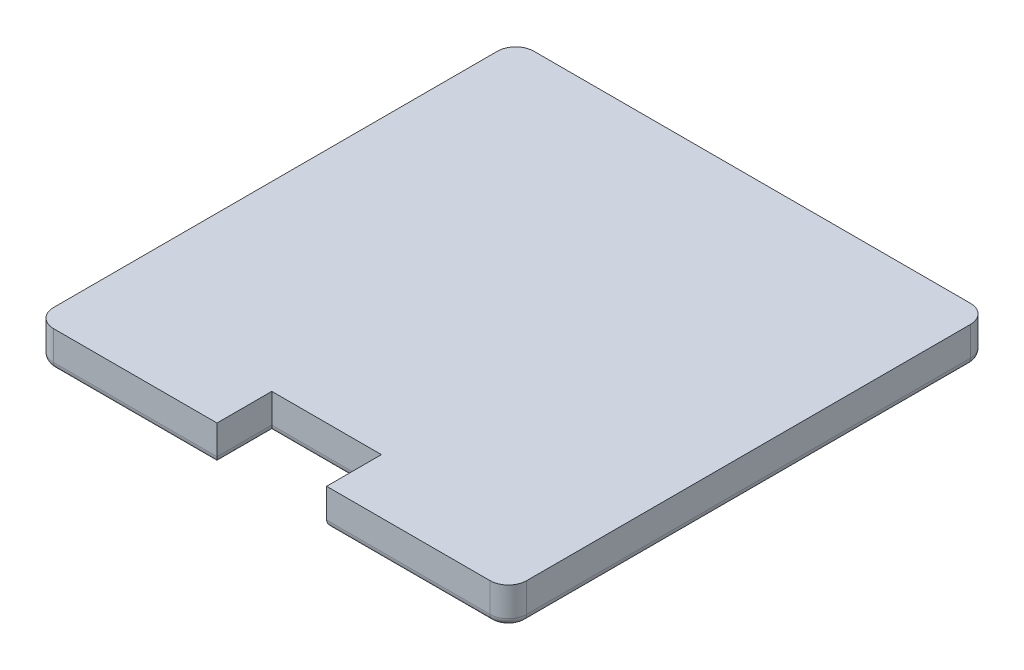
ISO-10303-21;
HEADER;
FILE_DESCRIPTION(('STEP AP214'),'2;1');
FILE_NAME('part.step','',(''),(''),'','','');
FILE_SCHEMA(('AUTOMOTIVE_DESIGN { 1 0 10303 214 1 1 1 1 }'));
ENDSEC;
DATA;
#1=APPLICATION_CONTEXT('core data for automotive mechanical design processes');
#2=APPLICATION_PROTOCOL_DEFINITION('international standard','automotive_design',2000,#1);
#3=PRODUCT_CONTEXT('',#1,'mechanical');
#4=PRODUCT('Part','Part','',(#3));
#5=PRODUCT_RELATED_PRODUCT_CATEGORY('part','',(#4));
#6=PRODUCT_DEFINITION_FORMATION('','',#4);
#7=PRODUCT_DEFINITION_CONTEXT('part definition',#1,'design');
#8=PRODUCT_DEFINITION('design','',#6,#7);
#9=PRODUCT_DEFINITION_SHAPE('','',#8);
#10=(LENGTH_UNIT() NAMED_UNIT(*) SI_UNIT(.MILLI.,.METRE.));
#11=(NAMED_UNIT(*) PLANE_ANGLE_UNIT() SI_UNIT($,.RADIAN.));
#12=(NAMED_UNIT(*) SI_UNIT($,.STERADIAN.) SOLID_ANGLE_UNIT());
#13=UNCERTAINTY_MEASURE_WITH_UNIT(LENGTH_MEASURE(1.E-05),#10,'distance_accuracy_value','');
#14=(GEOMETRIC_REPRESENTATION_CONTEXT(3) GLOBAL_UNCERTAINTY_ASSIGNED_CONTEXT((#13)) GLOBAL_UNIT_ASSIGNED_CONTEXT((#10,
#11,#12)) REPRESENTATION_CONTEXT('',''));
#15=CARTESIAN_POINT('',(0.,0.,0.));
#16=DIRECTION('',(0.,0.,1.));
#17=DIRECTION('',(1.,0.,0.));
#18=AXIS2_PLACEMENT_3D('',#15,#16,#17);
#19=CARTESIAN_POINT('',(-15.1765,2.54,15.4305));
#20=DIRECTION('',(0.,-1.,0.));
#21=DIRECTION('',(0.,0.,-1.));
#22=AXIS2_PLACEMENT_3D('',#19,#20,#21);
#23=CYLINDRICAL_SURFACE('',#22,1.27);
#24=DIRECTION('',(0.,-1.,0.));
#25=VECTOR('',#24,1.);
#26=CARTESIAN_POINT('',(-16.4465,2.54,15.4305));
#27=LINE('',#26,#25);
#28=CARTESIAN_POINT('',(-16.4465,2.54,15.4305));
#29=VERTEX_POINT('',#28);
#30=CARTESIAN_POINT('',(-16.4465,0.508,15.4305));
#31=VERTEX_POINT('',#30);
#32=EDGE_CURVE('E386',#29,#31,#27,.T.);
#33=ORIENTED_EDGE('',*,*,#32,.T.);
#34=CARTESIAN_POINT('',(-15.1765,0.508,15.4305));
#35=DIRECTION('',(0.,-1.,0.));
#36=DIRECTION('',(0.,0.,-1.));
#37=AXIS2_PLACEMENT_3D('',#34,#35,#36);
#38=CIRCLE('',#37,1.27);
#39=CARTESIAN_POINT('',(-15.1765,0.508,16.7005));
#40=VERTEX_POINT('',#39);
#41=EDGE_CURVE('E11',#31,#40,#38,.F.);
#42=ORIENTED_EDGE('',*,*,#41,.T.);
#43=DIRECTION('',(0.,-1.,0.));
#44=VECTOR('',#43,1.);
#45=CARTESIAN_POINT('',(-15.1765,2.54,16.7005));
#46=LINE('',#45,#44);
#47=CARTESIAN_POINT('',(-15.1765,2.54,16.7005));
#48=VERTEX_POINT('',#47);
#49=EDGE_CURVE('E179',#48,#40,#46,.T.);
#50=ORIENTED_EDGE('',*,*,#49,.F.);
#51=CARTESIAN_POINT('',(-15.1765,2.54,15.4305));
#52=DIRECTION('',(0.,1.,0.));
#53=DIRECTION('',(0.,0.,-1.));
#54=AXIS2_PLACEMENT_3D('',#51,#52,#53);
#55=CIRCLE('',#54,1.27);
#56=EDGE_CURVE('E187',#29,#48,#55,.T.);
#57=ORIENTED_EDGE('',*,*,#56,.F.);
#58=EDGE_LOOP('',(#33,#42,#50,#57));
#59=FACE_BOUND('',#58,.T.);
#60=ADVANCED_FACE('F45',(#59),#23,.T.);
#61=CARTESIAN_POINT('',(-15.1765,2.54,16.7005));
#62=DIRECTION('',(0.,0.,-1.));
#63=DIRECTION('',(-1.,0.,0.));
#64=AXIS2_PLACEMENT_3D('',#61,#62,#63);
#65=PLANE('',#64);
#66=ORIENTED_EDGE('',*,*,#49,.T.);
#67=DIRECTION('',(1.,0.,0.));
#68=VECTOR('',#67,1.);
#69=CARTESIAN_POINT('',(-3.81,0.508,16.7005));
#70=LINE('',#69,#68);
#71=CARTESIAN_POINT('',(-3.81,0.508,16.7005));
#72=VERTEX_POINT('',#71);
#73=EDGE_CURVE('E198',#40,#72,#70,.T.);
#74=ORIENTED_EDGE('',*,*,#73,.T.);
#75=DIRECTION('',(0.,-1.,0.));
#76=VECTOR('',#75,1.);
#77=CARTESIAN_POINT('',(-3.81,2.54,16.7005));
#78=LINE('',#77,#76);
#79=CARTESIAN_POINT('',(-3.81,2.54,16.7005));
#80=VERTEX_POINT('',#79);
#81=EDGE_CURVE('E182',#80,#72,#78,.T.);
#82=ORIENTED_EDGE('',*,*,#81,.F.);
#83=DIRECTION('',(1.,0.,0.));
#84=VECTOR('',#83,1.);
#85=CARTESIAN_POINT('',(-15.1765,2.54,16.7005));
#86=LINE('',#85,#84);
#87=EDGE_CURVE('E174',#48,#80,#86,.T.);
#88=ORIENTED_EDGE('',*,*,#87,.F.);
#89=EDGE_LOOP('',(#66,#74,#82,#88));
#90=FACE_BOUND('',#89,.T.);
#91=ADVANCED_FACE('F176',(#90),#65,.F.);
#92=CARTESIAN_POINT('',(-3.81,2.54,16.7005));
#93=DIRECTION('',(-1.,0.,0.));
#94=DIRECTION('',(0.,0.,1.));
#95=AXIS2_PLACEMENT_3D('',#92,#93,#94);
#96=PLANE('',#95);
#97=ORIENTED_EDGE('',*,*,#81,.T.);
#98=DIRECTION('',(0.,0.,-1.));
#99=VECTOR('',#98,1.);
#100=CARTESIAN_POINT('',(-3.81,0.508,12.8905));
#101=LINE('',#100,#99);
#102=CARTESIAN_POINT('',(-3.81,0.508,12.8905));
#103=VERTEX_POINT('',#102);
#104=EDGE_CURVE('E244',#72,#103,#101,.T.);
#105=ORIENTED_EDGE('',*,*,#104,.T.);
#106=DIRECTION('',(0.,-1.,0.));
#107=VECTOR('',#106,1.);
#108=CARTESIAN_POINT('',(-3.81,2.54,12.8905));
#109=LINE('',#108,#107);
#110=CARTESIAN_POINT('',(-3.81,2.54,12.8905));
#111=VERTEX_POINT('',#110);
#112=EDGE_CURVE('E204',#111,#103,#109,.T.);
#113=ORIENTED_EDGE('',*,*,#112,.F.);
#114=DIRECTION('',(0.,0.,-1.));
#115=VECTOR('',#114,1.);
#116=CARTESIAN_POINT('',(-3.81,2.54,16.7005));
#117=LINE('',#116,#115);
#118=EDGE_CURVE('E186',#80,#111,#117,.T.);
#119=ORIENTED_EDGE('',*,*,#118,.F.);
#120=EDGE_LOOP('',(#97,#105,#113,#119));
#121=FACE_BOUND('',#120,.T.);
#122=ADVANCED_FACE('F353',(#121),#96,.F.);
#123=CARTESIAN_POINT('',(-3.81,2.54,12.8905));
#124=DIRECTION('',(0.,0.,-1.));
#125=DIRECTION('',(-1.,0.,0.));
#126=AXIS2_PLACEMENT_3D('',#123,#124,#125);
#127=PLANE('',#126);
#128=ORIENTED_EDGE('',*,*,#112,.T.);
#129=DIRECTION('',(1.,0.,0.));
#130=VECTOR('',#129,1.);
#131=CARTESIAN_POINT('',(3.81,0.508,12.8905));
#132=LINE('',#131,#130);
#133=CARTESIAN_POINT('',(3.81,0.508,12.8905));
#134=VERTEX_POINT('',#133);
#135=EDGE_CURVE('E247',#103,#134,#132,.T.);
#136=ORIENTED_EDGE('',*,*,#135,.T.);
#137=DIRECTION('',(0.,-1.,0.));
#138=VECTOR('',#137,1.);
#139=CARTESIAN_POINT('',(3.81,2.54,12.8905));
#140=LINE('',#139,#138);
#141=CARTESIAN_POINT('',(3.81,2.54,12.8905));
#142=VERTEX_POINT('',#141);
#143=EDGE_CURVE('E415',#142,#134,#140,.T.);
#144=ORIENTED_EDGE('',*,*,#143,.F.);
#145=DIRECTION('',(1.,0.,0.));
#146=VECTOR('',#145,1.);
#147=CARTESIAN_POINT('',(-3.81,2.54,12.8905));
#148=LINE('',#147,#146);
#149=EDGE_CURVE('E358',#111,#142,#148,.T.);
#150=ORIENTED_EDGE('',*,*,#149,.F.);
#151=EDGE_LOOP('',(#128,#136,#144,#150));
#152=FACE_BOUND('',#151,.T.);
#153=ADVANCED_FACE('F421',(#152),#127,.F.);
#154=CARTESIAN_POINT('',(3.81,2.54,12.8905));
#155=DIRECTION('',(1.,0.,0.));
#156=DIRECTION('',(0.,0.,-1.));
#157=AXIS2_PLACEMENT_3D('',#154,#155,#156);
#158=PLANE('',#157);
#159=ORIENTED_EDGE('',*,*,#143,.T.);
#160=DIRECTION('',(0.,0.,1.));
#161=VECTOR('',#160,1.);
#162=CARTESIAN_POINT('',(3.81,0.508,16.7005));
#163=LINE('',#162,#161);
#164=CARTESIAN_POINT('',(3.81,0.508,16.7005));
#165=VERTEX_POINT('',#164);
#166=EDGE_CURVE('E250',#134,#165,#163,.T.);
#167=ORIENTED_EDGE('',*,*,#166,.T.);
#168=DIRECTION('',(0.,-1.,0.));
#169=VECTOR('',#168,1.);
#170=CARTESIAN_POINT('',(3.81,2.54,16.7005));
#171=LINE('',#170,#169);
#172=CARTESIAN_POINT('',(3.81,2.54,16.7005));
#173=VERTEX_POINT('',#172);
#174=EDGE_CURVE('E411',#173,#165,#171,.T.);
#175=ORIENTED_EDGE('',*,*,#174,.F.);
#176=DIRECTION('',(0.,0.,1.));
#177=VECTOR('',#176,1.);
#178=CARTESIAN_POINT('',(3.81,2.54,12.8905));
#179=LINE('',#178,#177);
#180=EDGE_CURVE('E361',#142,#173,#179,.T.);
#181=ORIENTED_EDGE('',*,*,#180,.F.);
#182=EDGE_LOOP('',(#159,#167,#175,#181));
#183=FACE_BOUND('',#182,.T.);
#184=ADVANCED_FACE('F439',(#183),#158,.F.);
#185=CARTESIAN_POINT('',(3.81,2.54,16.7005));
#186=DIRECTION('',(0.,0.,-1.));
#187=DIRECTION('',(-1.,0.,0.));
#188=AXIS2_PLACEMENT_3D('',#185,#186,#187);
#189=PLANE('',#188);
#190=ORIENTED_EDGE('',*,*,#174,.T.);
#191=DIRECTION('',(1.,0.,0.));
#192=VECTOR('',#191,1.);
#193=CARTESIAN_POINT('',(15.1765,0.508,16.7005));
#194=LINE('',#193,#192);
#195=CARTESIAN_POINT('',(15.1765,0.508,16.7005));
#196=VERTEX_POINT('',#195);
#197=EDGE_CURVE('E253',#165,#196,#194,.T.);
#198=ORIENTED_EDGE('',*,*,#197,.T.);
#199=DIRECTION('',(0.,-1.,0.));
#200=VECTOR('',#199,1.);
#201=CARTESIAN_POINT('',(15.1765,2.54,16.7005));
#202=LINE('',#201,#200);
#203=CARTESIAN_POINT('',(15.1765,2.54,16.7005));
#204=VERTEX_POINT('',#203);
#205=EDGE_CURVE('E407',#204,#196,#202,.T.);
#206=ORIENTED_EDGE('',*,*,#205,.F.);
#207=DIRECTION('',(1.,0.,0.));
#208=VECTOR('',#207,1.);
#209=CARTESIAN_POINT('',(3.81,2.54,16.7005));
#210=LINE('',#209,#208);
#211=EDGE_CURVE('E366',#173,#204,#210,.T.);
#212=ORIENTED_EDGE('',*,*,#211,.F.);
#213=EDGE_LOOP('',(#190,#198,#206,#212));
#214=FACE_BOUND('',#213,.T.);
#215=ADVANCED_FACE('F444',(#214),#189,.F.);
#216=CARTESIAN_POINT('',(15.1765,2.54,15.4305));
#217=DIRECTION('',(0.,-1.,0.));
#218=DIRECTION('',(0.,0.,-1.));
#219=AXIS2_PLACEMENT_3D('',#216,#217,#218);
#220=CYLINDRICAL_SURFACE('',#219,1.27);
#221=ORIENTED_EDGE('',*,*,#205,.T.);
#222=CARTESIAN_POINT('',(15.1765,0.508,15.4305));
#223=DIRECTION('',(0.,-1.,0.));
#224=DIRECTION('',(0.,0.,-1.));
#225=AXIS2_PLACEMENT_3D('',#222,#223,#224);
#226=CIRCLE('',#225,1.27);
#227=CARTESIAN_POINT('',(16.4465,0.508,15.4305));
#228=VERTEX_POINT('',#227);
#229=EDGE_CURVE('E256',#196,#228,#226,.F.);
#230=ORIENTED_EDGE('',*,*,#229,.T.);
#231=DIRECTION('',(0.,-1.,0.));
#232=VECTOR('',#231,1.);
#233=CARTESIAN_POINT('',(16.4465,2.54,15.4305));
#234=LINE('',#233,#232);
#235=CARTESIAN_POINT('',(16.4465,2.54,15.4305));
#236=VERTEX_POINT('',#235);
#237=EDGE_CURVE('E403',#236,#228,#234,.T.);
#238=ORIENTED_EDGE('',*,*,#237,.F.);
#239=CARTESIAN_POINT('',(15.1765,2.54,15.4305));
#240=DIRECTION('',(0.,1.,0.));
#241=DIRECTION('',(0.,0.,1.));
#242=AXIS2_PLACEMENT_3D('',#239,#240,#241);
#243=CIRCLE('',#242,1.27);
#244=EDGE_CURVE('E369',#204,#236,#243,.T.);
#245=ORIENTED_EDGE('',*,*,#244,.F.);
#246=EDGE_LOOP('',(#221,#230,#238,#245));
#247=FACE_BOUND('',#246,.T.);
#248=ADVANCED_FACE('F451',(#247),#220,.T.);
#249=CARTESIAN_POINT('',(16.4465,2.54,15.4305));
#250=DIRECTION('',(-1.,0.,0.));
#251=DIRECTION('',(0.,0.,1.));
#252=AXIS2_PLACEMENT_3D('',#249,#250,#251);
#253=PLANE('',#252);
#254=ORIENTED_EDGE('',*,*,#237,.T.);
#255=DIRECTION('',(0.,0.,-1.));
#256=VECTOR('',#255,1.);
#257=CARTESIAN_POINT('',(16.4465,0.508,-15.4305));
#258=LINE('',#257,#256);
#259=CARTESIAN_POINT('',(16.4465,0.508,-15.4305));
#260=VERTEX_POINT('',#259);
#261=EDGE_CURVE('E259',#228,#260,#258,.T.);
#262=ORIENTED_EDGE('',*,*,#261,.T.);
#263=DIRECTION('',(0.,-1.,0.));
#264=VECTOR('',#263,1.);
#265=CARTESIAN_POINT('',(16.4465,2.54,-15.4305));
#266=LINE('',#265,#264);
#267=CARTESIAN_POINT('',(16.4465,2.54,-15.4305));
#268=VERTEX_POINT('',#267);
#269=EDGE_CURVE('E399',#268,#260,#266,.T.);
#270=ORIENTED_EDGE('',*,*,#269,.F.);
#271=DIRECTION('',(0.,0.,-1.));
#272=VECTOR('',#271,1.);
#273=CARTESIAN_POINT('',(16.4465,2.54,15.4305));
#274=LINE('',#273,#272);
#275=EDGE_CURVE('E372',#236,#268,#274,.T.);
#276=ORIENTED_EDGE('',*,*,#275,.F.);
#277=EDGE_LOOP('',(#254,#262,#270,#276));
#278=FACE_BOUND('',#277,.T.);
#279=ADVANCED_FACE('F455',(#278),#253,.F.);
#280=CARTESIAN_POINT('',(15.1765,2.54,-15.4305));
#281=DIRECTION('',(0.,-1.,0.));
#282=DIRECTION('',(0.,0.,-1.));
#283=AXIS2_PLACEMENT_3D('',#280,#281,#282);
#284=CYLINDRICAL_SURFACE('',#283,1.27);
#285=ORIENTED_EDGE('',*,*,#269,.T.);
#286=CARTESIAN_POINT('',(15.1765,0.508,-15.4305));
#287=DIRECTION('',(0.,-1.,0.));
#288=DIRECTION('',(0.,0.,-1.));
#289=AXIS2_PLACEMENT_3D('',#286,#287,#288);
#290=CIRCLE('',#289,1.27);
#291=CARTESIAN_POINT('',(15.1765,0.508,-16.7005));
#292=VERTEX_POINT('',#291);
#293=EDGE_CURVE('E262',#260,#292,#290,.F.);
#294=ORIENTED_EDGE('',*,*,#293,.T.);
#295=DIRECTION('',(0.,-1.,0.));
#296=VECTOR('',#295,1.);
#297=CARTESIAN_POINT('',(15.1765,2.54,-16.7005));
#298=LINE('',#297,#296);
#299=CARTESIAN_POINT('',(15.1765,2.54,-16.7005));
#300=VERTEX_POINT('',#299);
#301=EDGE_CURVE('E395',#300,#292,#298,.T.);
#302=ORIENTED_EDGE('',*,*,#301,.F.);
#303=CARTESIAN_POINT('',(15.1765,2.54,-15.4305));
#304=DIRECTION('',(0.,1.,0.));
#305=DIRECTION('',(0.,0.,-1.));
#306=AXIS2_PLACEMENT_3D('',#303,#304,#305);
#307=CIRCLE('',#306,1.27);
#308=EDGE_CURVE('E375',#268,#300,#307,.T.);
#309=ORIENTED_EDGE('',*,*,#308,.F.);
#310=EDGE_LOOP('',(#285,#294,#302,#309));
#311=FACE_BOUND('',#310,.T.);
#312=ADVANCED_FACE('F462',(#311),#284,.T.);
#313=CARTESIAN_POINT('',(-15.1765,2.54,-16.7005));
#314=DIRECTION('',(0.,0.,1.));
#315=DIRECTION('',(1.,0.,0.));
#316=AXIS2_PLACEMENT_3D('',#313,#314,#315);
#317=PLANE('',#316);
#318=ORIENTED_EDGE('',*,*,#301,.T.);
#319=DIRECTION('',(-1.,0.,0.));
#320=VECTOR('',#319,1.);
#321=CARTESIAN_POINT('',(-15.1765,0.508,-16.7005));
#322=LINE('',#321,#320);
#323=CARTESIAN_POINT('',(-15.1765,0.508,-16.7005));
#324=VERTEX_POINT('',#323);
#325=EDGE_CURVE('E265',#292,#324,#322,.T.);
#326=ORIENTED_EDGE('',*,*,#325,.T.);
#327=DIRECTION('',(0.,-1.,0.));
#328=VECTOR('',#327,1.);
#329=CARTESIAN_POINT('',(-15.1765,2.54,-16.7005));
#330=LINE('',#329,#328);
#331=CARTESIAN_POINT('',(-15.1765,2.54,-16.7005));
#332=VERTEX_POINT('',#331);
#333=EDGE_CURVE('E392',#332,#324,#330,.T.);
#334=ORIENTED_EDGE('',*,*,#333,.F.);
#335=DIRECTION('',(-1.,0.,0.));
#336=VECTOR('',#335,1.);
#337=CARTESIAN_POINT('',(-15.1765,2.54,-16.7005));
#338=LINE('',#337,#336);
#339=EDGE_CURVE('E378',#300,#332,#338,.T.);
#340=ORIENTED_EDGE('',*,*,#339,.F.);
#341=EDGE_LOOP('',(#318,#326,#334,#340));
#342=FACE_BOUND('',#341,.T.);
#343=ADVANCED_FACE('F464',(#342),#317,.F.);
#344=CARTESIAN_POINT('',(-15.1765,2.54,-15.4305));
#345=DIRECTION('',(0.,-1.,0.));
#346=DIRECTION('',(0.,0.,-1.));
#347=AXIS2_PLACEMENT_3D('',#344,#345,#346);
#348=CYLINDRICAL_SURFACE('',#347,1.27);
#349=ORIENTED_EDGE('',*,*,#333,.T.);
#350=CARTESIAN_POINT('',(-15.1765,0.508,-15.4305));
#351=DIRECTION('',(0.,-1.,0.));
#352=DIRECTION('',(0.,0.,-1.));
#353=AXIS2_PLACEMENT_3D('',#350,#351,#352);
#354=CIRCLE('',#353,1.27);
#355=CARTESIAN_POINT('',(-16.4465,0.508,-15.4305));
#356=VERTEX_POINT('',#355);
#357=EDGE_CURVE('E70',#324,#356,#354,.F.);
#358=ORIENTED_EDGE('',*,*,#357,.T.);
#359=DIRECTION('',(0.,-1.,0.));
#360=VECTOR('',#359,1.);
#361=CARTESIAN_POINT('',(-16.4465,2.54,-15.4305));
#362=LINE('',#361,#360);
#363=CARTESIAN_POINT('',(-16.4465,2.54,-15.4305));
#364=VERTEX_POINT('',#363);
#365=EDGE_CURVE('E389',#364,#356,#362,.T.);
#366=ORIENTED_EDGE('',*,*,#365,.F.);
#367=CARTESIAN_POINT('',(-15.1765,2.54,-15.4305));
#368=DIRECTION('',(0.,1.,0.));
#369=DIRECTION('',(0.,0.,-1.));
#370=AXIS2_PLACEMENT_3D('',#367,#368,#369);
#371=CIRCLE('',#370,1.27);
#372=EDGE_CURVE('E381',#332,#364,#371,.T.);
#373=ORIENTED_EDGE('',*,*,#372,.F.);
#374=EDGE_LOOP('',(#349,#358,#366,#373));
#375=FACE_BOUND('',#374,.T.);
#376=ADVANCED_FACE('F466',(#375),#348,.T.);
#377=CARTESIAN_POINT('',(-16.4465,2.54,15.4305));
#378=DIRECTION('',(1.,0.,0.));
#379=DIRECTION('',(0.,0.,-1.));
#380=AXIS2_PLACEMENT_3D('',#377,#378,#379);
#381=PLANE('',#380);
#382=ORIENTED_EDGE('',*,*,#365,.T.);
#383=DIRECTION('',(0.,0.,1.));
#384=VECTOR('',#383,1.);
#385=CARTESIAN_POINT('',(-16.4465,0.508,15.4305));
#386=LINE('',#385,#384);
#387=EDGE_CURVE('E55',#356,#31,#386,.T.);
#388=ORIENTED_EDGE('',*,*,#387,.T.);
#389=ORIENTED_EDGE('',*,*,#32,.F.);
#390=DIRECTION('',(0.,0.,1.));
#391=VECTOR('',#390,1.);
#392=CARTESIAN_POINT('',(-16.4465,2.54,15.4305));
#393=LINE('',#392,#391);
#394=EDGE_CURVE('E192',#364,#29,#393,.T.);
#395=ORIENTED_EDGE('',*,*,#394,.F.);
#396=EDGE_LOOP('',(#382,#388,#389,#395));
#397=FACE_BOUND('',#396,.T.);
#398=ADVANCED_FACE('F467',(#397),#381,.F.);
#399=CARTESIAN_POINT('',(-15.1765,2.54,15.4305));
#400=DIRECTION('',(0.,-1.,0.));
#401=DIRECTION('',(0.,0.,-1.));
#402=AXIS2_PLACEMENT_3D('',#399,#400,#401);
#403=PLANE('',#402);
#404=ORIENTED_EDGE('',*,*,#56,.T.);
#405=ORIENTED_EDGE('',*,*,#87,.T.);
#406=ORIENTED_EDGE('',*,*,#118,.T.);
#407=ORIENTED_EDGE('',*,*,#149,.T.);
#408=ORIENTED_EDGE('',*,*,#180,.T.);
#409=ORIENTED_EDGE('',*,*,#211,.T.);
#410=ORIENTED_EDGE('',*,*,#244,.T.);
#411=ORIENTED_EDGE('',*,*,#275,.T.);
#412=ORIENTED_EDGE('',*,*,#308,.T.);
#413=ORIENTED_EDGE('',*,*,#339,.T.);
#414=ORIENTED_EDGE('',*,*,#372,.T.);
#415=ORIENTED_EDGE('',*,*,#394,.T.);
#416=EDGE_LOOP('',(#404,#405,#406,#407,#408,#409,#410,#411,#412,#413,#414,#415));
#417=FACE_BOUND('',#416,.T.);
#418=ADVANCED_FACE('F190',(#417),#403,.F.);
#419=CARTESIAN_POINT('',(-15.1765,0.,15.4305));
#420=DIRECTION('',(0.,-1.,0.));
#421=DIRECTION('',(0.,0.,-1.));
#422=AXIS2_PLACEMENT_3D('',#419,#420,#421);
#423=PLANE('',#422);
#424=DIRECTION('',(0.,0.,-1.));
#425=VECTOR('',#424,1.);
#426=CARTESIAN_POINT('',(-4.318,0.,16.7005));
#427=LINE('',#426,#425);
#428=CARTESIAN_POINT('',(-4.318,0.,12.3825));
#429=VERTEX_POINT('',#428);
#430=CARTESIAN_POINT('',(-4.318,0.,16.1925));
#431=VERTEX_POINT('',#430);
#432=EDGE_CURVE('E237',#429,#431,#427,.F.);
#433=ORIENTED_EDGE('',*,*,#432,.T.);
#434=DIRECTION('',(1.,0.,0.));
#435=VECTOR('',#434,1.);
#436=CARTESIAN_POINT('',(-15.1765,0.,16.1925));
#437=LINE('',#436,#435);
#438=CARTESIAN_POINT('',(-15.1765,0.,16.1925));
#439=VERTEX_POINT('',#438);
#440=EDGE_CURVE('E240',#431,#439,#437,.F.);
#441=ORIENTED_EDGE('',*,*,#440,.T.);
#442=CARTESIAN_POINT('',(-15.1765,0.,15.4305));
#443=DIRECTION('',(0.,-1.,0.));
#444=DIRECTION('',(0.,0.,-1.));
#445=AXIS2_PLACEMENT_3D('',#442,#443,#444);
#446=CIRCLE('',#445,0.762);
#447=CARTESIAN_POINT('',(-15.9385,0.,15.4305));
#448=VERTEX_POINT('',#447);
#449=EDGE_CURVE('E202',#439,#448,#446,.T.);
#450=ORIENTED_EDGE('',*,*,#449,.T.);
#451=DIRECTION('',(0.,0.,1.));
#452=VECTOR('',#451,1.);
#453=CARTESIAN_POINT('',(-15.9385,0.,-15.4305));
#454=LINE('',#453,#452);
#455=CARTESIAN_POINT('',(-15.9385,0.,-15.4305));
#456=VERTEX_POINT('',#455);
#457=EDGE_CURVE('E210',#448,#456,#454,.F.);
#458=ORIENTED_EDGE('',*,*,#457,.T.);
#459=CARTESIAN_POINT('',(-15.1765,0.,-15.4305));
#460=DIRECTION('',(0.,-1.,0.));
#461=DIRECTION('',(0.,0.,-1.));
#462=AXIS2_PLACEMENT_3D('',#459,#460,#461);
#463=CIRCLE('',#462,0.762);
#464=CARTESIAN_POINT('',(-15.1765,0.,-16.1925));
#465=VERTEX_POINT('',#464);
#466=EDGE_CURVE('E213',#456,#465,#463,.T.);
#467=ORIENTED_EDGE('',*,*,#466,.T.);
#468=DIRECTION('',(-1.,0.,0.));
#469=VECTOR('',#468,1.);
#470=CARTESIAN_POINT('',(15.1765,0.,-16.1925));
#471=LINE('',#470,#469);
#472=CARTESIAN_POINT('',(15.1765,0.,-16.1925));
#473=VERTEX_POINT('',#472);
#474=EDGE_CURVE('E216',#465,#473,#471,.F.);
#475=ORIENTED_EDGE('',*,*,#474,.T.);
#476=CARTESIAN_POINT('',(15.1765,0.,-15.4305));
#477=DIRECTION('',(0.,-1.,0.));
#478=DIRECTION('',(0.,0.,-1.));
#479=AXIS2_PLACEMENT_3D('',#476,#477,#478);
#480=CIRCLE('',#479,0.762);
#481=CARTESIAN_POINT('',(15.9385,0.,-15.4305));
#482=VERTEX_POINT('',#481);
#483=EDGE_CURVE('E219',#473,#482,#480,.T.);
#484=ORIENTED_EDGE('',*,*,#483,.T.);
#485=DIRECTION('',(0.,0.,-1.));
#486=VECTOR('',#485,1.);
#487=CARTESIAN_POINT('',(15.9385,0.,15.4305));
#488=LINE('',#487,#486);
#489=CARTESIAN_POINT('',(15.9385,0.,15.4305));
#490=VERTEX_POINT('',#489);
#491=EDGE_CURVE('E222',#482,#490,#488,.F.);
#492=ORIENTED_EDGE('',*,*,#491,.T.);
#493=CARTESIAN_POINT('',(15.1765,0.,15.4305));
#494=DIRECTION('',(0.,-1.,0.));
#495=DIRECTION('',(0.,0.,-1.));
#496=AXIS2_PLACEMENT_3D('',#493,#494,#495);
#497=CIRCLE('',#496,0.762);
#498=CARTESIAN_POINT('',(15.1765,0.,16.1925));
#499=VERTEX_POINT('',#498);
#500=EDGE_CURVE('E225',#490,#499,#497,.T.);
#501=ORIENTED_EDGE('',*,*,#500,.T.);
#502=DIRECTION('',(1.,0.,0.));
#503=VECTOR('',#502,1.);
#504=CARTESIAN_POINT('',(3.81,0.,16.1925));
#505=LINE('',#504,#503);
#506=CARTESIAN_POINT('',(4.318,0.,16.1925));
#507=VERTEX_POINT('',#506);
#508=EDGE_CURVE('E228',#499,#507,#505,.F.);
#509=ORIENTED_EDGE('',*,*,#508,.T.);
#510=DIRECTION('',(0.,0.,1.));
#511=VECTOR('',#510,1.);
#512=CARTESIAN_POINT('',(4.318,0.,12.8905));
#513=LINE('',#512,#511);
#514=CARTESIAN_POINT('',(4.318,0.,12.3825));
#515=VERTEX_POINT('',#514);
#516=EDGE_CURVE('E231',#507,#515,#513,.F.);
#517=ORIENTED_EDGE('',*,*,#516,.T.);
#518=DIRECTION('',(1.,0.,0.));
#519=VECTOR('',#518,1.);
#520=CARTESIAN_POINT('',(-3.81,0.,12.3825));
#521=LINE('',#520,#519);
#522=EDGE_CURVE('E234',#515,#429,#521,.F.);
#523=ORIENTED_EDGE('',*,*,#522,.T.);
#524=EDGE_LOOP('',(#433,#441,#450,#458,#467,#475,#484,#492,#501,#509,#517,#523));
#525=FACE_BOUND('',#524,.T.);
#526=ADVANCED_FACE('F328',(#525),#423,.T.);
#527=CARTESIAN_POINT('',(15.9385,0.508,15.4305));
#528=DIRECTION('',(0.,0.,1.));
#529=DIRECTION('',(1.,0.,0.));
#530=AXIS2_PLACEMENT_3D('',#527,#528,#529);
#531=CYLINDRICAL_SURFACE('',#530,0.508);
#532=CARTESIAN_POINT('',(15.9385,0.508,15.4305));
#533=DIRECTION('',(0.,0.,1.));
#534=DIRECTION('',(1.,0.,0.));
#535=AXIS2_PLACEMENT_3D('',#532,#533,#534);
#536=CIRCLE('',#535,0.508);
#537=EDGE_CURVE('E309',#490,#228,#536,.T.);
#538=ORIENTED_EDGE('',*,*,#537,.F.);
#539=ORIENTED_EDGE('',*,*,#491,.F.);
#540=CARTESIAN_POINT('',(15.9385,0.508,-15.4305));
#541=DIRECTION('',(0.,0.,-1.));
#542=DIRECTION('',(-1.,0.,0.));
#543=AXIS2_PLACEMENT_3D('',#540,#541,#542);
#544=CIRCLE('',#543,0.508);
#545=EDGE_CURVE('E49',#260,#482,#544,.T.);
#546=ORIENTED_EDGE('',*,*,#545,.F.);
#547=ORIENTED_EDGE('',*,*,#261,.F.);
#548=EDGE_LOOP('',(#538,#539,#546,#547));
#549=FACE_BOUND('',#548,.T.);
#550=ADVANCED_FACE('F47',(#549),#531,.T.);
#551=CARTESIAN_POINT('',(15.1765,0.508,-15.4305));
#552=DIRECTION('',(0.,-1.,0.));
#553=DIRECTION('',(0.,0.,-1.));
#554=AXIS2_PLACEMENT_3D('',#551,#552,#553);
#555=TOROIDAL_SURFACE('',#554,0.762,0.508);
#556=ORIENTED_EDGE('',*,*,#545,.T.);
#557=ORIENTED_EDGE('',*,*,#483,.F.);
#558=CARTESIAN_POINT('',(15.1765,0.508,-16.1925));
#559=DIRECTION('',(-1.,0.,0.));
#560=DIRECTION('',(0.,0.,1.));
#561=AXIS2_PLACEMENT_3D('',#558,#559,#560);
#562=CIRCLE('',#561,0.508);
#563=EDGE_CURVE('E306',#292,#473,#562,.T.);
#564=ORIENTED_EDGE('',*,*,#563,.F.);
#565=ORIENTED_EDGE('',*,*,#293,.F.);
#566=EDGE_LOOP('',(#556,#557,#564,#565));
#567=FACE_BOUND('',#566,.T.);
#568=ADVANCED_FACE('F322',(#567),#555,.T.);
#569=CARTESIAN_POINT('',(15.1765,0.508,15.4305));
#570=DIRECTION('',(0.,-1.,0.));
#571=DIRECTION('',(0.,0.,-1.));
#572=AXIS2_PLACEMENT_3D('',#569,#570,#571);
#573=TOROIDAL_SURFACE('',#572,0.762,0.508);
#574=ORIENTED_EDGE('',*,*,#537,.T.);
#575=ORIENTED_EDGE('',*,*,#229,.F.);
#576=CARTESIAN_POINT('',(15.1765,0.508,16.1925));
#577=DIRECTION('',(-1.,0.,0.));
#578=DIRECTION('',(0.,0.,1.));
#579=AXIS2_PLACEMENT_3D('',#576,#577,#578);
#580=CIRCLE('',#579,0.508);
#581=EDGE_CURVE('E302',#499,#196,#580,.T.);
#582=ORIENTED_EDGE('',*,*,#581,.F.);
#583=ORIENTED_EDGE('',*,*,#500,.F.);
#584=EDGE_LOOP('',(#574,#575,#582,#583));
#585=FACE_BOUND('',#584,.T.);
#586=ADVANCED_FACE('F448',(#585),#573,.T.);
#587=CARTESIAN_POINT('',(-15.1765,0.508,-16.1925));
#588=DIRECTION('',(1.,0.,0.));
#589=DIRECTION('',(0.,0.,-1.));
#590=AXIS2_PLACEMENT_3D('',#587,#588,#589);
#591=CYLINDRICAL_SURFACE('',#590,0.508);
#592=ORIENTED_EDGE('',*,*,#563,.T.);
#593=ORIENTED_EDGE('',*,*,#474,.F.);
#594=CARTESIAN_POINT('',(-15.1765,0.508,-16.1925));
#595=DIRECTION('',(-1.,0.,0.));
#596=DIRECTION('',(0.,0.,1.));
#597=AXIS2_PLACEMENT_3D('',#594,#595,#596);
#598=CIRCLE('',#597,0.508);
#599=EDGE_CURVE('E298',#324,#465,#598,.T.);
#600=ORIENTED_EDGE('',*,*,#599,.F.);
#601=ORIENTED_EDGE('',*,*,#325,.F.);
#602=EDGE_LOOP('',(#592,#593,#600,#601));
#603=FACE_BOUND('',#602,.T.);
#604=ADVANCED_FACE('F334',(#603),#591,.T.);
#605=CARTESIAN_POINT('',(3.81,0.508,16.1925));
#606=DIRECTION('',(-1.,0.,0.));
#607=DIRECTION('',(0.,0.,1.));
#608=AXIS2_PLACEMENT_3D('',#605,#606,#607);
#609=CYLINDRICAL_SURFACE('',#608,0.508);
#610=ORIENTED_EDGE('',*,*,#581,.T.);
#611=ORIENTED_EDGE('',*,*,#197,.F.);
#612=CARTESIAN_POINT('',(4.318,0.508,16.1925));
#613=DIRECTION('',(-0.707106781186547,0.,-0.707106781186547));
#614=DIRECTION('',(-0.707106781186547,0.,0.707106781186547));
#615=AXIS2_PLACEMENT_3D('',#612,#613,#614);
#616=ELLIPSE('',#615,0.718420489685532,0.508);
#617=EDGE_CURVE('E294',#507,#165,#616,.T.);
#618=ORIENTED_EDGE('',*,*,#617,.F.);
#619=ORIENTED_EDGE('',*,*,#508,.F.);
#620=EDGE_LOOP('',(#610,#611,#618,#619));
#621=FACE_BOUND('',#620,.T.);
#622=ADVANCED_FACE('F447',(#621),#609,.T.);
#623=CARTESIAN_POINT('',(-15.1765,0.508,-15.4305));
#624=DIRECTION('',(0.,-1.,0.));
#625=DIRECTION('',(0.,0.,-1.));
#626=AXIS2_PLACEMENT_3D('',#623,#624,#625);
#627=TOROIDAL_SURFACE('',#626,0.762,0.508);
#628=ORIENTED_EDGE('',*,*,#599,.T.);
#629=ORIENTED_EDGE('',*,*,#466,.F.);
#630=CARTESIAN_POINT('',(-15.9385,0.508,-15.4305));
#631=DIRECTION('',(0.,0.,1.));
#632=DIRECTION('',(1.,0.,0.));
#633=AXIS2_PLACEMENT_3D('',#630,#631,#632);
#634=CIRCLE('',#633,0.508);
#635=EDGE_CURVE('E290',#356,#456,#634,.T.);
#636=ORIENTED_EDGE('',*,*,#635,.F.);
#637=ORIENTED_EDGE('',*,*,#357,.F.);
#638=EDGE_LOOP('',(#628,#629,#636,#637));
#639=FACE_BOUND('',#638,.T.);
#640=ADVANCED_FACE('F337',(#639),#627,.T.);
#641=CARTESIAN_POINT('',(4.318,0.508,12.8905));
#642=DIRECTION('',(0.,0.,-1.));
#643=DIRECTION('',(-1.,0.,0.));
#644=AXIS2_PLACEMENT_3D('',#641,#642,#643);
#645=CYLINDRICAL_SURFACE('',#644,0.508);
#646=ORIENTED_EDGE('',*,*,#617,.T.);
#647=ORIENTED_EDGE('',*,*,#166,.F.);
#648=CARTESIAN_POINT('',(4.318,0.508,12.3825));
#649=DIRECTION('',(-0.707106781186547,0.,-0.707106781186547));
#650=DIRECTION('',(-0.707106781186547,0.,0.707106781186547));
#651=AXIS2_PLACEMENT_3D('',#648,#649,#650);
#652=ELLIPSE('',#651,0.718420489685532,0.508);
#653=EDGE_CURVE('E286',#515,#134,#652,.T.);
#654=ORIENTED_EDGE('',*,*,#653,.F.);
#655=ORIENTED_EDGE('',*,*,#516,.F.);
#656=EDGE_LOOP('',(#646,#647,#654,#655));
#657=FACE_BOUND('',#656,.T.);
#658=ADVANCED_FACE('F436',(#657),#645,.T.);
#659=CARTESIAN_POINT('',(-15.9385,0.508,15.4305));
#660=DIRECTION('',(0.,0.,-1.));
#661=DIRECTION('',(-1.,0.,0.));
#662=AXIS2_PLACEMENT_3D('',#659,#660,#661);
#663=CYLINDRICAL_SURFACE('',#662,0.508);
#664=ORIENTED_EDGE('',*,*,#635,.T.);
#665=ORIENTED_EDGE('',*,*,#457,.F.);
#666=CARTESIAN_POINT('',(-15.9385,0.508,15.4305));
#667=DIRECTION('',(0.,0.,1.));
#668=DIRECTION('',(1.,0.,0.));
#669=AXIS2_PLACEMENT_3D('',#666,#667,#668);
#670=CIRCLE('',#669,0.508);
#671=EDGE_CURVE('E282',#31,#448,#670,.T.);
#672=ORIENTED_EDGE('',*,*,#671,.F.);
#673=ORIENTED_EDGE('',*,*,#387,.F.);
#674=EDGE_LOOP('',(#664,#665,#672,#673));
#675=FACE_BOUND('',#674,.T.);
#676=ADVANCED_FACE('F342',(#675),#663,.T.);
#677=CARTESIAN_POINT('',(-3.81,0.508,12.3825));
#678=DIRECTION('',(-1.,0.,0.));
#679=DIRECTION('',(0.,0.,1.));
#680=AXIS2_PLACEMENT_3D('',#677,#678,#679);
#681=CYLINDRICAL_SURFACE('',#680,0.508);
#682=ORIENTED_EDGE('',*,*,#653,.T.);
#683=ORIENTED_EDGE('',*,*,#135,.F.);
#684=CARTESIAN_POINT('',(-4.318,0.508,12.3825));
#685=DIRECTION('',(-0.707106781186547,0.,0.707106781186547));
#686=DIRECTION('',(0.707106781186547,0.,0.707106781186547));
#687=AXIS2_PLACEMENT_3D('',#684,#685,#686);
#688=ELLIPSE('',#687,0.718420489685532,0.508);
#689=EDGE_CURVE('E278',#429,#103,#688,.T.);
#690=ORIENTED_EDGE('',*,*,#689,.F.);
#691=ORIENTED_EDGE('',*,*,#522,.F.);
#692=EDGE_LOOP('',(#682,#683,#690,#691));
#693=FACE_BOUND('',#692,.T.);
#694=ADVANCED_FACE('F425',(#693),#681,.T.);
#695=CARTESIAN_POINT('',(-15.1765,0.508,15.4305));
#696=DIRECTION('',(0.,-1.,0.));
#697=DIRECTION('',(0.,0.,-1.));
#698=AXIS2_PLACEMENT_3D('',#695,#696,#697);
#699=TOROIDAL_SURFACE('',#698,0.762,0.508);
#700=ORIENTED_EDGE('',*,*,#671,.T.);
#701=ORIENTED_EDGE('',*,*,#449,.F.);
#702=CARTESIAN_POINT('',(-15.1765,0.508,16.1925));
#703=DIRECTION('',(1.,0.,0.));
#704=DIRECTION('',(0.,1.,0.));
#705=AXIS2_PLACEMENT_3D('',#702,#703,#704);
#706=CIRCLE('',#705,0.508);
#707=EDGE_CURVE('E275',#40,#439,#706,.T.);
#708=ORIENTED_EDGE('',*,*,#707,.F.);
#709=ORIENTED_EDGE('',*,*,#41,.F.);
#710=EDGE_LOOP('',(#700,#701,#708,#709));
#711=FACE_BOUND('',#710,.T.);
#712=ADVANCED_FACE('F345',(#711),#699,.T.);
#713=CARTESIAN_POINT('',(-4.318,0.508,16.7005));
#714=DIRECTION('',(0.,0.,1.));
#715=DIRECTION('',(1.,0.,0.));
#716=AXIS2_PLACEMENT_3D('',#713,#714,#715);
#717=CYLINDRICAL_SURFACE('',#716,0.508);
#718=ORIENTED_EDGE('',*,*,#689,.T.);
#719=ORIENTED_EDGE('',*,*,#104,.F.);
#720=CARTESIAN_POINT('',(-4.318,0.508,16.1925));
#721=DIRECTION('',(-0.707106781186547,0.,0.707106781186547));
#722=DIRECTION('',(0.707106781186547,0.,0.707106781186547));
#723=AXIS2_PLACEMENT_3D('',#720,#721,#722);
#724=ELLIPSE('',#723,0.718420489685532,0.508);
#725=EDGE_CURVE('E272',#431,#72,#724,.T.);
#726=ORIENTED_EDGE('',*,*,#725,.F.);
#727=ORIENTED_EDGE('',*,*,#432,.F.);
#728=EDGE_LOOP('',(#718,#719,#726,#727));
#729=FACE_BOUND('',#728,.T.);
#730=ADVANCED_FACE('F430',(#729),#717,.T.);
#731=CARTESIAN_POINT('',(-15.1765,0.508,16.1925));
#732=DIRECTION('',(-1.,0.,0.));
#733=DIRECTION('',(0.,0.,1.));
#734=AXIS2_PLACEMENT_3D('',#731,#732,#733);
#735=CYLINDRICAL_SURFACE('',#734,0.508);
#736=ORIENTED_EDGE('',*,*,#707,.T.);
#737=ORIENTED_EDGE('',*,*,#440,.F.);
#738=ORIENTED_EDGE('',*,*,#725,.T.);
#739=ORIENTED_EDGE('',*,*,#73,.F.);
#740=EDGE_LOOP('',(#736,#737,#738,#739));
#741=FACE_BOUND('',#740,.T.);
#742=ADVANCED_FACE('F349',(#741),#735,.T.);
#743=CLOSED_SHELL('',(#60,#91,#122,#153,#184,#215,#248,#279,#312,#343,#376,#398,#418,#526,#550,
#568,#586,#604,#622,#640,#658,#676,#694,#712,#730,#742));
#744=MANIFOLD_SOLID_BREP('B2',#743);
#745=ADVANCED_BREP_SHAPE_REPRESENTATION('',(#18,#744),#14);
#746=SHAPE_DEFINITION_REPRESENTATION(#9,#745);
ENDSEC;
END-ISO-10303-21;
